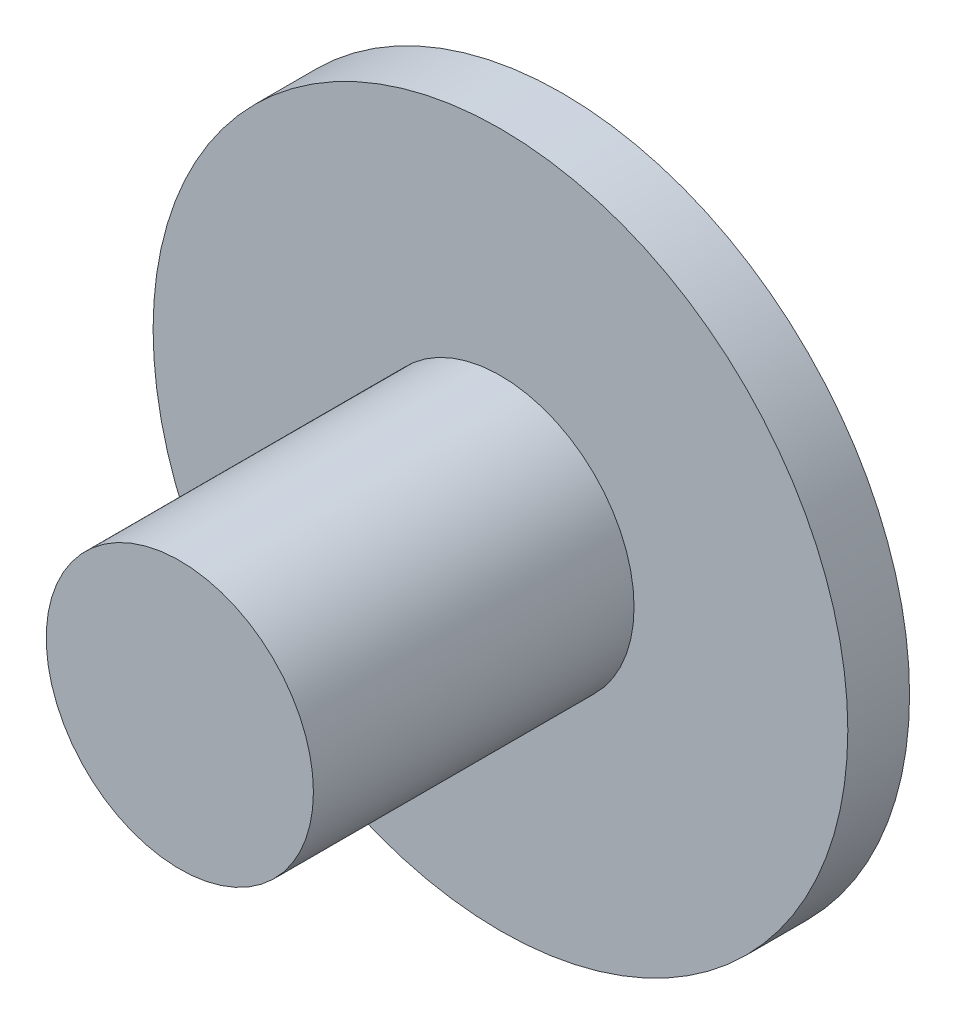
ISO-10303-21;
HEADER;
FILE_DESCRIPTION(('STEP AP214'),'2;1');
FILE_NAME('part.step','',(''),(''),'','','');
FILE_SCHEMA(('AUTOMOTIVE_DESIGN { 1 0 10303 214 1 1 1 1 }'));
ENDSEC;
DATA;
#1=APPLICATION_CONTEXT('core data for automotive mechanical design processes');
#2=APPLICATION_PROTOCOL_DEFINITION('international standard','automotive_design',2000,#1);
#3=PRODUCT_CONTEXT('',#1,'mechanical');
#4=PRODUCT('Part','Part','',(#3));
#5=PRODUCT_RELATED_PRODUCT_CATEGORY('part','',(#4));
#6=PRODUCT_DEFINITION_FORMATION('','',#4);
#7=PRODUCT_DEFINITION_CONTEXT('part definition',#1,'design');
#8=PRODUCT_DEFINITION('design','',#6,#7);
#9=PRODUCT_DEFINITION_SHAPE('','',#8);
#10=(LENGTH_UNIT() NAMED_UNIT(*) SI_UNIT(.MILLI.,.METRE.));
#11=(NAMED_UNIT(*) PLANE_ANGLE_UNIT() SI_UNIT($,.RADIAN.));
#12=(NAMED_UNIT(*) SI_UNIT($,.STERADIAN.) SOLID_ANGLE_UNIT());
#13=UNCERTAINTY_MEASURE_WITH_UNIT(LENGTH_MEASURE(1.E-05),#10,'distance_accuracy_value','');
#14=(GEOMETRIC_REPRESENTATION_CONTEXT(3) GLOBAL_UNCERTAINTY_ASSIGNED_CONTEXT((#13)) GLOBAL_UNIT_ASSIGNED_CONTEXT((#10,
#11,#12)) REPRESENTATION_CONTEXT('',''));
#15=CARTESIAN_POINT('',(0.,0.,0.));
#16=DIRECTION('',(0.,0.,1.));
#17=DIRECTION('',(1.,0.,0.));
#18=AXIS2_PLACEMENT_3D('',#15,#16,#17);
#19=CARTESIAN_POINT('',(0.,0.,124.871327596205));
#20=DIRECTION('',(0.,0.,-1.));
#21=DIRECTION('',(-1.,0.,0.));
#22=AXIS2_PLACEMENT_3D('',#19,#20,#21);
#23=CYLINDRICAL_SURFACE('',#22,14.49675);
#24=CARTESIAN_POINT('',(0.,0.,83.3804275962054));
#25=DIRECTION('',(0.,0.,-1.));
#26=DIRECTION('',(-1.,0.,0.));
#27=AXIS2_PLACEMENT_3D('',#24,#25,#26);
#28=CIRCLE('',#27,14.49675);
#29=CARTESIAN_POINT('',(-14.49675,0.,83.3804275962054));
#30=VERTEX_POINT('',#29);
#31=EDGE_CURVE('E51',#30,#30,#28,.T.);
#32=ORIENTED_EDGE('',*,*,#31,.T.);
#33=EDGE_LOOP('',(#32));
#34=FACE_BOUND('',#33,.T.);
#35=CARTESIAN_POINT('',(0.,0.,68.7109225962054));
#36=DIRECTION('',(0.,0.,-1.));
#37=DIRECTION('',(-1.,0.,0.));
#38=AXIS2_PLACEMENT_3D('',#35,#36,#37);
#39=CIRCLE('',#38,14.49675);
#40=CARTESIAN_POINT('',(-14.49675,0.,68.7109225962054));
#41=VERTEX_POINT('',#40);
#42=EDGE_CURVE('E38',#41,#41,#39,.T.);
#43=ORIENTED_EDGE('',*,*,#42,.F.);
#44=EDGE_LOOP('',(#43));
#45=FACE_BOUND('',#44,.T.);
#46=ADVANCED_FACE('F34',(#34,#45),#23,.T.);
#47=CARTESIAN_POINT('',(-14.49675,0.,90.0791275962054));
#48=DIRECTION('',(0.,0.,1.));
#49=DIRECTION('',(1.,0.,0.));
#50=AXIS2_PLACEMENT_3D('',#47,#48,#49);
#51=PLANE('',#50);
#52=CARTESIAN_POINT('',(0.,0.,90.0791275962054));
#53=DIRECTION('',(0.,0.,1.));
#54=DIRECTION('',(1.,0.,0.));
#55=AXIS2_PLACEMENT_3D('',#52,#53,#54);
#56=CIRCLE('',#55,14.49675);
#57=CARTESIAN_POINT('',(14.49675,0.,90.0791275962054));
#58=VERTEX_POINT('',#57);
#59=EDGE_CURVE('E42',#58,#58,#56,.T.);
#60=ORIENTED_EDGE('',*,*,#59,.F.);
#61=EDGE_LOOP('',(#60));
#62=FACE_BOUND('',#61,.T.);
#63=CARTESIAN_POINT('',(0.,0.,90.0791275962053));
#64=DIRECTION('',(0.,0.,-1.));
#65=DIRECTION('',(-1.,0.,0.));
#66=AXIS2_PLACEMENT_3D('',#63,#64,#65);
#67=CIRCLE('',#66,37.69155);
#68=CARTESIAN_POINT('',(-37.69155,0.,90.0791275962054));
#69=VERTEX_POINT('',#68);
#70=EDGE_CURVE('E47',#69,#69,#67,.T.);
#71=ORIENTED_EDGE('',*,*,#70,.F.);
#72=EDGE_LOOP('',(#71));
#73=FACE_BOUND('',#72,.T.);
#74=ADVANCED_FACE('F66',(#62,#73),#51,.T.);
#75=CARTESIAN_POINT('',(0.,0.,84.2804275962054));
#76=DIRECTION('',(0.,0.,-1.));
#77=DIRECTION('',(-1.,0.,0.));
#78=AXIS2_PLACEMENT_3D('',#75,#76,#77);
#79=CYLINDRICAL_SURFACE('',#78,37.69155);
#80=ORIENTED_EDGE('',*,*,#70,.T.);
#81=EDGE_LOOP('',(#80));
#82=FACE_BOUND('',#81,.T.);
#83=CARTESIAN_POINT('',(0.,0.,83.3804275962054));
#84=DIRECTION('',(0.,0.,-1.));
#85=DIRECTION('',(-1.,0.,0.));
#86=AXIS2_PLACEMENT_3D('',#83,#84,#85);
#87=CIRCLE('',#86,37.69155);
#88=CARTESIAN_POINT('',(-37.69155,0.,83.3804275962054));
#89=VERTEX_POINT('',#88);
#90=EDGE_CURVE('E53',#89,#89,#87,.T.);
#91=ORIENTED_EDGE('',*,*,#90,.F.);
#92=EDGE_LOOP('',(#91));
#93=FACE_BOUND('',#92,.T.);
#94=ADVANCED_FACE('F70',(#82,#93),#79,.T.);
#95=CARTESIAN_POINT('',(0.,0.,124.871327596205));
#96=DIRECTION('',(0.,0.,1.));
#97=DIRECTION('',(1.,0.,0.));
#98=AXIS2_PLACEMENT_3D('',#95,#96,#97);
#99=PLANE('',#98);
#100=CARTESIAN_POINT('',(0.,0.,124.871327596205));
#101=DIRECTION('',(0.,0.,1.));
#102=DIRECTION('',(1.,0.,0.));
#103=AXIS2_PLACEMENT_3D('',#100,#101,#102);
#104=CIRCLE('',#103,14.49675);
#105=CARTESIAN_POINT('',(14.49675,0.,124.871327596205));
#106=VERTEX_POINT('',#105);
#107=EDGE_CURVE('E10',#106,#106,#104,.T.);
#108=ORIENTED_EDGE('',*,*,#107,.T.);
#109=EDGE_LOOP('',(#108));
#110=FACE_BOUND('',#109,.T.);
#111=ADVANCED_FACE('F75',(#110),#99,.T.);
#112=ORIENTED_EDGE('',*,*,#59,.T.);
#113=EDGE_LOOP('',(#112));
#114=FACE_BOUND('',#113,.T.);
#115=ORIENTED_EDGE('',*,*,#107,.F.);
#116=EDGE_LOOP('',(#115));
#117=FACE_BOUND('',#116,.T.);
#118=ADVANCED_FACE('F36',(#114,#117),#23,.T.);
#119=CARTESIAN_POINT('',(0.,0.,83.3804275962054));
#120=DIRECTION('',(0.,0.,-1.));
#121=DIRECTION('',(-1.,0.,0.));
#122=AXIS2_PLACEMENT_3D('',#119,#120,#121);
#123=PLANE('',#122);
#124=ORIENTED_EDGE('',*,*,#31,.F.);
#125=EDGE_LOOP('',(#124));
#126=FACE_BOUND('',#125,.T.);
#127=ORIENTED_EDGE('',*,*,#90,.T.);
#128=EDGE_LOOP('',(#127));
#129=FACE_BOUND('',#128,.T.);
#130=ADVANCED_FACE('F74',(#126,#129),#123,.T.);
#131=CARTESIAN_POINT('',(0.,40.0350928494249,68.7109225962054));
#132=DIRECTION('',(0.,0.,-1.));
#133=DIRECTION('',(-1.,0.,0.));
#134=AXIS2_PLACEMENT_3D('',#131,#132,#133);
#135=PLANE('',#134);
#136=ORIENTED_EDGE('',*,*,#42,.T.);
#137=EDGE_LOOP('',(#136));
#138=FACE_BOUND('',#137,.T.);
#139=ADVANCED_FACE('F63',(#138),#135,.T.);
#140=CLOSED_SHELL('',(#46,#74,#94,#111,#118,#130,#139));
#141=MANIFOLD_SOLID_BREP('B2',#140);
#142=ADVANCED_BREP_SHAPE_REPRESENTATION('',(#18,#141),#14);
#143=SHAPE_DEFINITION_REPRESENTATION(#9,#142);
ENDSEC;
END-ISO-10303-21;
